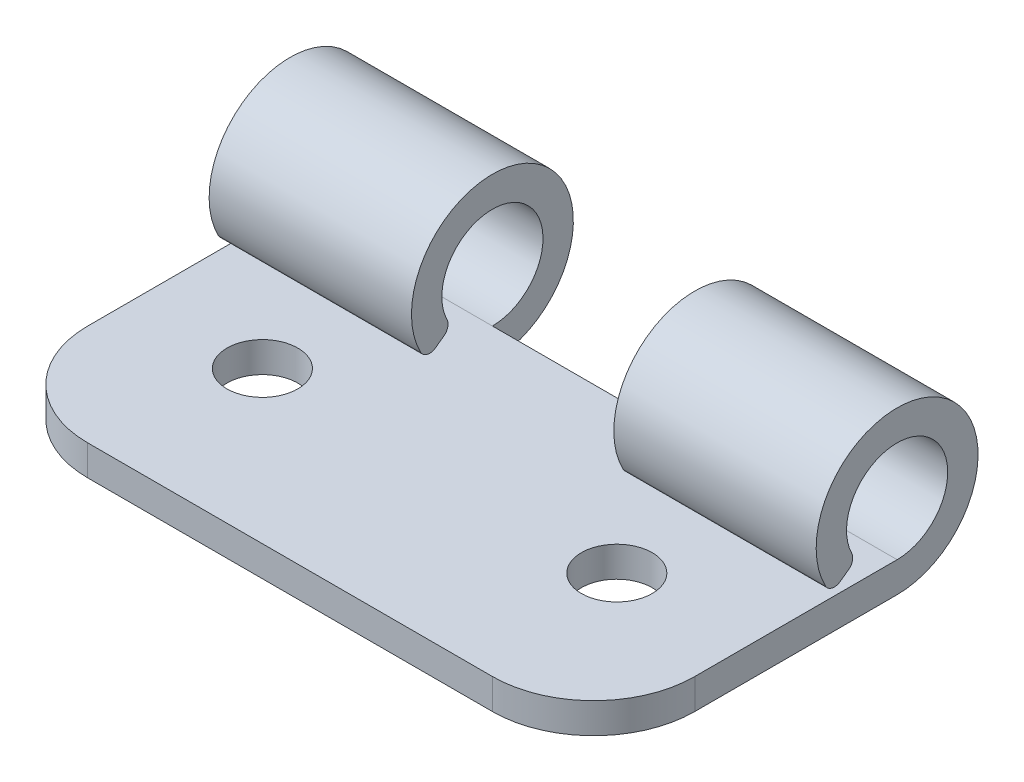
ISO-10303-21;
HEADER;
FILE_DESCRIPTION(('STEP AP214'),'2;1');
FILE_NAME('part.step','',(''),(''),'','','');
FILE_SCHEMA(('AUTOMOTIVE_DESIGN { 1 0 10303 214 1 1 1 1 }'));
ENDSEC;
DATA;
#1=APPLICATION_CONTEXT('core data for automotive mechanical design processes');
#2=APPLICATION_PROTOCOL_DEFINITION('international standard','automotive_design',2000,#1);
#3=PRODUCT_CONTEXT('',#1,'mechanical');
#4=PRODUCT('Part','Part','',(#3));
#5=PRODUCT_RELATED_PRODUCT_CATEGORY('part','',(#4));
#6=PRODUCT_DEFINITION_FORMATION('','',#4);
#7=PRODUCT_DEFINITION_CONTEXT('part definition',#1,'design');
#8=PRODUCT_DEFINITION('design','',#6,#7);
#9=PRODUCT_DEFINITION_SHAPE('','',#8);
#10=(LENGTH_UNIT() NAMED_UNIT(*) SI_UNIT(.MILLI.,.METRE.));
#11=(NAMED_UNIT(*) PLANE_ANGLE_UNIT() SI_UNIT($,.RADIAN.));
#12=(NAMED_UNIT(*) SI_UNIT($,.STERADIAN.) SOLID_ANGLE_UNIT());
#13=UNCERTAINTY_MEASURE_WITH_UNIT(LENGTH_MEASURE(1.E-05),#10,'distance_accuracy_value','');
#14=(GEOMETRIC_REPRESENTATION_CONTEXT(3) GLOBAL_UNCERTAINTY_ASSIGNED_CONTEXT((#13)) GLOBAL_UNIT_ASSIGNED_CONTEXT((#10,
#11,#12)) REPRESENTATION_CONTEXT('',''));
#15=CARTESIAN_POINT('',(0.,0.,0.));
#16=DIRECTION('',(0.,0.,1.));
#17=DIRECTION('',(1.,0.,0.));
#18=AXIS2_PLACEMENT_3D('',#15,#16,#17);
#19=CARTESIAN_POINT('',(-15.,1.5,-7.5));
#20=DIRECTION('',(0.,0.,-1.));
#21=DIRECTION('',(-1.,0.,0.));
#22=AXIS2_PLACEMENT_3D('',#19,#20,#21);
#23=PLANE('',#22);
#24=DIRECTION('',(1.,0.,0.));
#25=VECTOR('',#24,1.);
#26=CARTESIAN_POINT('',(-15.,0.,-7.5));
#27=LINE('',#26,#25);
#28=CARTESIAN_POINT('',(-5.,0.,-7.5));
#29=VERTEX_POINT('',#28);
#30=CARTESIAN_POINT('',(5.,0.,-7.5));
#31=VERTEX_POINT('',#30);
#32=EDGE_CURVE('E92',#29,#31,#27,.T.);
#33=ORIENTED_EDGE('',*,*,#32,.F.);
#34=DIRECTION('',(0.,-1.,0.));
#35=VECTOR('',#34,1.);
#36=CARTESIAN_POINT('',(-5.,1.5,-7.5));
#37=LINE('',#36,#35);
#38=CARTESIAN_POINT('',(-5.,1.5,-7.5));
#39=VERTEX_POINT('',#38);
#40=EDGE_CURVE('E183',#39,#29,#37,.T.);
#41=ORIENTED_EDGE('',*,*,#40,.F.);
#42=DIRECTION('',(1.,0.,0.));
#43=VECTOR('',#42,1.);
#44=CARTESIAN_POINT('',(-15.,1.5,-7.5));
#45=LINE('',#44,#43);
#46=CARTESIAN_POINT('',(5.,1.5,-7.5));
#47=VERTEX_POINT('',#46);
#48=EDGE_CURVE('E84',#39,#47,#45,.T.);
#49=ORIENTED_EDGE('',*,*,#48,.T.);
#50=DIRECTION('',(0.,-1.,0.));
#51=VECTOR('',#50,1.);
#52=CARTESIAN_POINT('',(5.,1.5,-7.5));
#53=LINE('',#52,#51);
#54=EDGE_CURVE('E203',#47,#31,#53,.T.);
#55=ORIENTED_EDGE('',*,*,#54,.T.);
#56=EDGE_LOOP('',(#33,#41,#49,#55));
#57=FACE_BOUND('',#56,.T.);
#58=ADVANCED_FACE('F69',(#57),#23,.T.);
#59=CARTESIAN_POINT('',(0.,1.5,0.));
#60=DIRECTION('',(0.,-1.,0.));
#61=DIRECTION('',(0.,0.,-1.));
#62=AXIS2_PLACEMENT_3D('',#59,#60,#61);
#63=PLANE('',#62);
#64=DIRECTION('',(1.,0.,0.));
#65=VECTOR('',#64,1.);
#66=CARTESIAN_POINT('',(-15.,1.5,7.5));
#67=LINE('',#66,#65);
#68=CARTESIAN_POINT('',(-10.,1.5,7.5));
#69=VERTEX_POINT('',#68);
#70=CARTESIAN_POINT('',(10.,1.5,7.5));
#71=VERTEX_POINT('',#70);
#72=EDGE_CURVE('E224',#69,#71,#67,.T.);
#73=ORIENTED_EDGE('',*,*,#72,.T.);
#74=CARTESIAN_POINT('',(10.,1.5,2.5));
#75=DIRECTION('',(0.,-1.,0.));
#76=DIRECTION('',(0.,0.,-1.));
#77=AXIS2_PLACEMENT_3D('',#74,#75,#76);
#78=CIRCLE('',#77,5.);
#79=CARTESIAN_POINT('',(15.,1.5,2.5));
#80=VERTEX_POINT('',#79);
#81=EDGE_CURVE('E77',#71,#80,#78,.F.);
#82=ORIENTED_EDGE('',*,*,#81,.T.);
#83=DIRECTION('',(0.,0.,-1.));
#84=VECTOR('',#83,1.);
#85=CARTESIAN_POINT('',(15.,1.5,7.5));
#86=LINE('',#85,#84);
#87=CARTESIAN_POINT('',(15.,1.5,-7.5));
#88=VERTEX_POINT('',#87);
#89=EDGE_CURVE('E240',#80,#88,#86,.T.);
#90=ORIENTED_EDGE('',*,*,#89,.T.);
#91=DIRECTION('',(1.,0.,0.));
#92=VECTOR('',#91,1.);
#93=CARTESIAN_POINT('',(5.,1.5,-7.5));
#94=LINE('',#93,#92);
#95=EDGE_CURVE('E287',#47,#88,#94,.T.);
#96=ORIENTED_EDGE('',*,*,#95,.F.);
#97=ORIENTED_EDGE('',*,*,#48,.F.);
#98=CARTESIAN_POINT('',(-15.,1.5,-7.5));
#99=VERTEX_POINT('',#98);
#100=EDGE_CURVE('E252',#99,#39,#45,.T.);
#101=ORIENTED_EDGE('',*,*,#100,.F.);
#102=DIRECTION('',(0.,0.,-1.));
#103=VECTOR('',#102,1.);
#104=CARTESIAN_POINT('',(-15.,1.5,7.5));
#105=LINE('',#104,#103);
#106=CARTESIAN_POINT('',(-15.,1.5,2.5));
#107=VERTEX_POINT('',#106);
#108=EDGE_CURVE('E219',#107,#99,#105,.T.);
#109=ORIENTED_EDGE('',*,*,#108,.F.);
#110=CARTESIAN_POINT('',(-10.,1.5,2.5));
#111=DIRECTION('',(0.,-1.,0.));
#112=DIRECTION('',(0.,0.,-1.));
#113=AXIS2_PLACEMENT_3D('',#110,#111,#112);
#114=CIRCLE('',#113,5.);
#115=EDGE_CURVE('E233',#107,#69,#114,.F.);
#116=ORIENTED_EDGE('',*,*,#115,.T.);
#117=EDGE_LOOP('',(#73,#82,#90,#96,#97,#101,#109,#116));
#118=FACE_BOUND('',#117,.T.);
#119=CARTESIAN_POINT('',(-8.86733098836335,1.5,0.));
#120=DIRECTION('',(0.,1.,0.));
#121=DIRECTION('',(0.,0.,1.));
#122=AXIS2_PLACEMENT_3D('',#119,#120,#121);
#123=CIRCLE('',#122,1.75);
#124=CARTESIAN_POINT('',(-8.86733098836335,1.5,1.75));
#125=VERTEX_POINT('',#124);
#126=EDGE_CURVE('E267',#125,#125,#123,.T.);
#127=ORIENTED_EDGE('',*,*,#126,.F.);
#128=EDGE_LOOP('',(#127));
#129=FACE_BOUND('',#128,.T.);
#130=CARTESIAN_POINT('',(8.64739718707362,1.5,0.));
#131=DIRECTION('',(0.,1.,0.));
#132=DIRECTION('',(0.,0.,1.));
#133=AXIS2_PLACEMENT_3D('',#130,#131,#132);
#134=CIRCLE('',#133,1.75);
#135=CARTESIAN_POINT('',(8.64739718707362,1.5,1.75));
#136=VERTEX_POINT('',#135);
#137=EDGE_CURVE('E274',#136,#136,#134,.T.);
#138=ORIENTED_EDGE('',*,*,#137,.F.);
#139=EDGE_LOOP('',(#138));
#140=FACE_BOUND('',#139,.T.);
#141=ADVANCED_FACE('F238',(#118,#129,#140),#63,.F.);
#142=CARTESIAN_POINT('',(0.,0.,0.));
#143=DIRECTION('',(0.,-1.,0.));
#144=DIRECTION('',(0.,0.,-1.));
#145=AXIS2_PLACEMENT_3D('',#142,#143,#144);
#146=PLANE('',#145);
#147=CARTESIAN_POINT('',(-8.86733098836335,0.,0.));
#148=DIRECTION('',(0.,1.,0.));
#149=DIRECTION('',(0.,0.,1.));
#150=AXIS2_PLACEMENT_3D('',#147,#148,#149);
#151=CIRCLE('',#150,1.75);
#152=CARTESIAN_POINT('',(-8.86733098836335,0.,1.75));
#153=VERTEX_POINT('',#152);
#154=EDGE_CURVE('E269',#153,#153,#151,.T.);
#155=ORIENTED_EDGE('',*,*,#154,.T.);
#156=EDGE_LOOP('',(#155));
#157=FACE_BOUND('',#156,.T.);
#158=DIRECTION('',(0.,0.,-1.));
#159=VECTOR('',#158,1.);
#160=CARTESIAN_POINT('',(15.,0.,7.5));
#161=LINE('',#160,#159);
#162=CARTESIAN_POINT('',(15.,0.,2.5));
#163=VERTEX_POINT('',#162);
#164=CARTESIAN_POINT('',(15.,0.,-7.5));
#165=VERTEX_POINT('',#164);
#166=EDGE_CURVE('E211',#163,#165,#161,.T.);
#167=ORIENTED_EDGE('',*,*,#166,.F.);
#168=CARTESIAN_POINT('',(10.,0.,2.5));
#169=DIRECTION('',(0.,-1.,0.));
#170=DIRECTION('',(0.,0.,-1.));
#171=AXIS2_PLACEMENT_3D('',#168,#169,#170);
#172=CIRCLE('',#171,5.);
#173=CARTESIAN_POINT('',(10.,0.,7.5));
#174=VERTEX_POINT('',#173);
#175=EDGE_CURVE('E226',#163,#174,#172,.T.);
#176=ORIENTED_EDGE('',*,*,#175,.T.);
#177=DIRECTION('',(1.,0.,0.));
#178=VECTOR('',#177,1.);
#179=CARTESIAN_POINT('',(-15.,0.,7.5));
#180=LINE('',#179,#178);
#181=CARTESIAN_POINT('',(-10.,0.,7.5));
#182=VERTEX_POINT('',#181);
#183=EDGE_CURVE('E212',#182,#174,#180,.T.);
#184=ORIENTED_EDGE('',*,*,#183,.F.);
#185=CARTESIAN_POINT('',(-10.,0.,2.5));
#186=DIRECTION('',(0.,-1.,0.));
#187=DIRECTION('',(0.,0.,-1.));
#188=AXIS2_PLACEMENT_3D('',#185,#186,#187);
#189=CIRCLE('',#188,5.);
#190=CARTESIAN_POINT('',(-15.,0.,2.5));
#191=VERTEX_POINT('',#190);
#192=EDGE_CURVE('E223',#182,#191,#189,.T.);
#193=ORIENTED_EDGE('',*,*,#192,.T.);
#194=DIRECTION('',(0.,0.,-1.));
#195=VECTOR('',#194,1.);
#196=CARTESIAN_POINT('',(-15.,0.,7.5));
#197=LINE('',#196,#195);
#198=CARTESIAN_POINT('',(-15.,0.,-7.5));
#199=VERTEX_POINT('',#198);
#200=EDGE_CURVE('E205',#191,#199,#197,.T.);
#201=ORIENTED_EDGE('',*,*,#200,.T.);
#202=EDGE_CURVE('E196',#199,#29,#27,.T.);
#203=ORIENTED_EDGE('',*,*,#202,.T.);
#204=ORIENTED_EDGE('',*,*,#32,.T.);
#205=DIRECTION('',(1.,0.,0.));
#206=VECTOR('',#205,1.);
#207=CARTESIAN_POINT('',(5.,0.,-7.5));
#208=LINE('',#207,#206);
#209=EDGE_CURVE('E290',#31,#165,#208,.T.);
#210=ORIENTED_EDGE('',*,*,#209,.T.);
#211=EDGE_LOOP('',(#167,#176,#184,#193,#201,#203,#204,#210));
#212=FACE_BOUND('',#211,.T.);
#213=CARTESIAN_POINT('',(8.64739718707362,0.,0.));
#214=DIRECTION('',(0.,1.,0.));
#215=DIRECTION('',(0.,0.,1.));
#216=AXIS2_PLACEMENT_3D('',#213,#214,#215);
#217=CIRCLE('',#216,1.75);
#218=CARTESIAN_POINT('',(8.64739718707362,0.,1.75));
#219=VERTEX_POINT('',#218);
#220=EDGE_CURVE('E277',#219,#219,#217,.T.);
#221=ORIENTED_EDGE('',*,*,#220,.T.);
#222=EDGE_LOOP('',(#221));
#223=FACE_BOUND('',#222,.T.);
#224=ADVANCED_FACE('F208',(#157,#212,#223),#146,.T.);
#225=CARTESIAN_POINT('',(-15.,1.5,7.5));
#226=DIRECTION('',(-1.,0.,0.));
#227=DIRECTION('',(0.,0.,1.));
#228=AXIS2_PLACEMENT_3D('',#225,#226,#227);
#229=PLANE('',#228);
#230=ORIENTED_EDGE('',*,*,#200,.F.);
#231=DIRECTION('',(0.,-1.,0.));
#232=VECTOR('',#231,1.);
#233=CARTESIAN_POINT('',(-15.,1.5,2.5));
#234=LINE('',#233,#232);
#235=EDGE_CURVE('E12',#191,#107,#234,.F.);
#236=ORIENTED_EDGE('',*,*,#235,.T.);
#237=ORIENTED_EDGE('',*,*,#108,.T.);
#238=CARTESIAN_POINT('',(-15.,4.,-7.5));
#239=DIRECTION('',(-1.,0.,0.));
#240=DIRECTION('',(0.,0.,-1.));
#241=AXIS2_PLACEMENT_3D('',#238,#239,#240);
#242=CIRCLE('',#241,2.5);
#243=CARTESIAN_POINT('',(-15.,2.8971410584487,-5.25640864793957));
#244=VERTEX_POINT('',#243);
#245=EDGE_CURVE('E286',#244,#99,#242,.T.);
#246=ORIENTED_EDGE('',*,*,#245,.F.);
#247=CARTESIAN_POINT('',(-15.,2.67656927013843,-4.80769037752749));
#248=DIRECTION('',(1.,0.,0.));
#249=DIRECTION('',(0.,0.,1.));
#250=AXIS2_PLACEMENT_3D('',#247,#248,#249);
#251=CIRCLE('',#250,0.5);
#252=CARTESIAN_POINT('',(-15.,2.27088905354142,-5.09996347218691));
#253=VERTEX_POINT('',#252);
#254=EDGE_CURVE('E576',#253,#244,#251,.T.);
#255=ORIENTED_EDGE('',*,*,#254,.F.);
#256=DIRECTION('',(0.,0.58454618931885,-0.811360433194035));
#257=VECTOR('',#256,1.);
#258=CARTESIAN_POINT('',(-15.,1.97507260145795,-4.68936501291368));
#259=LINE('',#258,#257);
#260=CARTESIAN_POINT('',(-15.,1.97507260145795,-4.68936501291368));
#261=VERTEX_POINT('',#260);
#262=EDGE_CURVE('E582',#261,#253,#259,.T.);
#263=ORIENTED_EDGE('',*,*,#262,.F.);
#264=CARTESIAN_POINT('',(-15.,2.38075281805497,-4.39709191825425));
#265=DIRECTION('',(1.,0.,0.));
#266=DIRECTION('',(0.,0.,1.));
#267=AXIS2_PLACEMENT_3D('',#264,#265,#266);
#268=CIRCLE('',#267,0.5);
#269=CARTESIAN_POINT('',(-15.,2.14943179206282,-3.95381933514772));
#270=VERTEX_POINT('',#269);
#271=EDGE_CURVE('E200',#270,#261,#268,.T.);
#272=ORIENTED_EDGE('',*,*,#271,.F.);
#273=CARTESIAN_POINT('',(-15.,4.,-7.5));
#274=DIRECTION('',(1.,0.,0.));
#275=DIRECTION('',(0.,0.,-1.));
#276=AXIS2_PLACEMENT_3D('',#273,#274,#275);
#277=CIRCLE('',#276,4.);
#278=EDGE_CURVE('E266',#199,#270,#277,.T.);
#279=ORIENTED_EDGE('',*,*,#278,.F.);
#280=EDGE_LOOP('',(#230,#236,#237,#246,#255,#263,#272,#279));
#281=FACE_BOUND('',#280,.T.);
#282=ADVANCED_FACE('F263',(#281),#229,.T.);
#283=CARTESIAN_POINT('',(-15.,1.5,7.5));
#284=DIRECTION('',(0.,0.,-1.));
#285=DIRECTION('',(-1.,0.,0.));
#286=AXIS2_PLACEMENT_3D('',#283,#284,#285);
#287=PLANE('',#286);
#288=ORIENTED_EDGE('',*,*,#183,.T.);
#289=DIRECTION('',(0.,-1.,0.));
#290=VECTOR('',#289,1.);
#291=CARTESIAN_POINT('',(10.,1.5,7.5));
#292=LINE('',#291,#290);
#293=EDGE_CURVE('E231',#174,#71,#292,.F.);
#294=ORIENTED_EDGE('',*,*,#293,.T.);
#295=ORIENTED_EDGE('',*,*,#72,.F.);
#296=DIRECTION('',(0.,-1.,0.));
#297=VECTOR('',#296,1.);
#298=CARTESIAN_POINT('',(-10.,0.,7.5));
#299=LINE('',#298,#297);
#300=EDGE_CURVE('E228',#69,#182,#299,.T.);
#301=ORIENTED_EDGE('',*,*,#300,.T.);
#302=EDGE_LOOP('',(#288,#294,#295,#301));
#303=FACE_BOUND('',#302,.T.);
#304=ADVANCED_FACE('F257',(#303),#287,.F.);
#305=CARTESIAN_POINT('',(15.,1.5,7.5));
#306=DIRECTION('',(-1.,0.,0.));
#307=DIRECTION('',(0.,0.,1.));
#308=AXIS2_PLACEMENT_3D('',#305,#306,#307);
#309=PLANE('',#308);
#310=ORIENTED_EDGE('',*,*,#89,.F.);
#311=DIRECTION('',(0.,-1.,0.));
#312=VECTOR('',#311,1.);
#313=CARTESIAN_POINT('',(15.,1.5,2.5));
#314=LINE('',#313,#312);
#315=EDGE_CURVE('E220',#80,#163,#314,.T.);
#316=ORIENTED_EDGE('',*,*,#315,.T.);
#317=ORIENTED_EDGE('',*,*,#166,.T.);
#318=CARTESIAN_POINT('',(15.,4.,-7.5));
#319=DIRECTION('',(1.,0.,0.));
#320=DIRECTION('',(0.,0.,-1.));
#321=AXIS2_PLACEMENT_3D('',#318,#319,#320);
#322=CIRCLE('',#321,4.);
#323=CARTESIAN_POINT('',(15.,2.14943179206282,-3.95381933514772));
#324=VERTEX_POINT('',#323);
#325=EDGE_CURVE('E312',#165,#324,#322,.T.);
#326=ORIENTED_EDGE('',*,*,#325,.T.);
#327=CARTESIAN_POINT('',(15.,2.38075281805497,-4.39709191825425));
#328=DIRECTION('',(1.,0.,0.));
#329=DIRECTION('',(0.,0.,1.));
#330=AXIS2_PLACEMENT_3D('',#327,#328,#329);
#331=CIRCLE('',#330,0.5);
#332=CARTESIAN_POINT('',(15.,1.97507260145795,-4.68936501291368));
#333=VERTEX_POINT('',#332);
#334=EDGE_CURVE('E315',#324,#333,#331,.T.);
#335=ORIENTED_EDGE('',*,*,#334,.T.);
#336=DIRECTION('',(0.,0.58454618931885,-0.811360433194035));
#337=VECTOR('',#336,1.);
#338=CARTESIAN_POINT('',(15.,1.97507260145795,-4.68936501291368));
#339=LINE('',#338,#337);
#340=CARTESIAN_POINT('',(15.,2.27088905354142,-5.09996347218691));
#341=VERTEX_POINT('',#340);
#342=EDGE_CURVE('E318',#333,#341,#339,.T.);
#343=ORIENTED_EDGE('',*,*,#342,.T.);
#344=CARTESIAN_POINT('',(15.,2.67656927013843,-4.80769037752749));
#345=DIRECTION('',(1.,0.,0.));
#346=DIRECTION('',(0.,0.,1.));
#347=AXIS2_PLACEMENT_3D('',#344,#345,#346);
#348=CIRCLE('',#347,0.5);
#349=CARTESIAN_POINT('',(15.,2.8971410584487,-5.25640864793957));
#350=VERTEX_POINT('',#349);
#351=EDGE_CURVE('E321',#341,#350,#348,.T.);
#352=ORIENTED_EDGE('',*,*,#351,.T.);
#353=CARTESIAN_POINT('',(15.,4.,-7.5));
#354=DIRECTION('',(-1.,0.,0.));
#355=DIRECTION('',(0.,0.,-1.));
#356=AXIS2_PLACEMENT_3D('',#353,#354,#355);
#357=CIRCLE('',#356,2.5);
#358=EDGE_CURVE('E251',#350,#88,#357,.T.);
#359=ORIENTED_EDGE('',*,*,#358,.T.);
#360=EDGE_LOOP('',(#310,#316,#317,#326,#335,#343,#352,#359));
#361=FACE_BOUND('',#360,.T.);
#362=ADVANCED_FACE('F248',(#361),#309,.F.);
#363=CARTESIAN_POINT('',(-8.86733098836335,1.5,0.));
#364=DIRECTION('',(0.,-1.,0.));
#365=DIRECTION('',(0.,0.,-1.));
#366=AXIS2_PLACEMENT_3D('',#363,#364,#365);
#367=CYLINDRICAL_SURFACE('',#366,1.75);
#368=ORIENTED_EDGE('',*,*,#126,.T.);
#369=EDGE_LOOP('',(#368));
#370=FACE_BOUND('',#369,.T.);
#371=ORIENTED_EDGE('',*,*,#154,.F.);
#372=EDGE_LOOP('',(#371));
#373=FACE_BOUND('',#372,.T.);
#374=ADVANCED_FACE('F336',(#370,#373),#367,.F.);
#375=CARTESIAN_POINT('',(8.64739718707362,1.5,0.));
#376=DIRECTION('',(0.,-1.,0.));
#377=DIRECTION('',(0.,0.,-1.));
#378=AXIS2_PLACEMENT_3D('',#375,#376,#377);
#379=CYLINDRICAL_SURFACE('',#378,1.75);
#380=ORIENTED_EDGE('',*,*,#137,.T.);
#381=EDGE_LOOP('',(#380));
#382=FACE_BOUND('',#381,.T.);
#383=ORIENTED_EDGE('',*,*,#220,.F.);
#384=EDGE_LOOP('',(#383));
#385=FACE_BOUND('',#384,.T.);
#386=ADVANCED_FACE('F334',(#382,#385),#379,.F.);
#387=CARTESIAN_POINT('',(10.,1.5,2.5));
#388=DIRECTION('',(0.,-1.,0.));
#389=DIRECTION('',(0.,0.,-1.));
#390=AXIS2_PLACEMENT_3D('',#387,#388,#389);
#391=CYLINDRICAL_SURFACE('',#390,5.);
#392=ORIENTED_EDGE('',*,*,#81,.F.);
#393=ORIENTED_EDGE('',*,*,#293,.F.);
#394=ORIENTED_EDGE('',*,*,#175,.F.);
#395=ORIENTED_EDGE('',*,*,#315,.F.);
#396=EDGE_LOOP('',(#392,#393,#394,#395));
#397=FACE_BOUND('',#396,.T.);
#398=ADVANCED_FACE('F254',(#397),#391,.T.);
#399=CARTESIAN_POINT('',(-10.,1.5,2.5));
#400=DIRECTION('',(0.,1.,0.));
#401=DIRECTION('',(0.,0.,1.));
#402=AXIS2_PLACEMENT_3D('',#399,#400,#401);
#403=CYLINDRICAL_SURFACE('',#402,5.);
#404=ORIENTED_EDGE('',*,*,#115,.F.);
#405=ORIENTED_EDGE('',*,*,#235,.F.);
#406=ORIENTED_EDGE('',*,*,#192,.F.);
#407=ORIENTED_EDGE('',*,*,#300,.F.);
#408=EDGE_LOOP('',(#404,#405,#406,#407));
#409=FACE_BOUND('',#408,.T.);
#410=ADVANCED_FACE('F71',(#409),#403,.T.);
#411=CARTESIAN_POINT('',(5.,4.,-7.5));
#412=DIRECTION('',(1.,0.,0.));
#413=DIRECTION('',(0.,0.,-1.));
#414=AXIS2_PLACEMENT_3D('',#411,#412,#413);
#415=CYLINDRICAL_SURFACE('',#414,4.);
#416=ORIENTED_EDGE('',*,*,#325,.F.);
#417=ORIENTED_EDGE('',*,*,#209,.F.);
#418=CARTESIAN_POINT('',(5.,4.,-7.5));
#419=DIRECTION('',(1.,0.,0.));
#420=DIRECTION('',(0.,0.,-1.));
#421=AXIS2_PLACEMENT_3D('',#418,#419,#420);
#422=CIRCLE('',#421,4.);
#423=CARTESIAN_POINT('',(5.,2.14943179206282,-3.95381933514772));
#424=VERTEX_POINT('',#423);
#425=EDGE_CURVE('E305',#31,#424,#422,.T.);
#426=ORIENTED_EDGE('',*,*,#425,.T.);
#427=DIRECTION('',(1.,0.,0.));
#428=VECTOR('',#427,1.);
#429=CARTESIAN_POINT('',(5.,2.14943179206282,-3.95381933514772));
#430=LINE('',#429,#428);
#431=EDGE_CURVE('E306',#424,#324,#430,.T.);
#432=ORIENTED_EDGE('',*,*,#431,.T.);
#433=EDGE_LOOP('',(#416,#417,#426,#432));
#434=FACE_BOUND('',#433,.T.);
#435=ADVANCED_FACE('F428',(#434),#415,.T.);
#436=CARTESIAN_POINT('',(5.,4.,-7.5));
#437=DIRECTION('',(1.,0.,0.));
#438=DIRECTION('',(0.,0.,-1.));
#439=AXIS2_PLACEMENT_3D('',#436,#437,#438);
#440=CYLINDRICAL_SURFACE('',#439,2.5);
#441=ORIENTED_EDGE('',*,*,#358,.F.);
#442=DIRECTION('',(1.,0.,0.));
#443=VECTOR('',#442,1.);
#444=CARTESIAN_POINT('',(5.,2.8971410584487,-5.25640864793957));
#445=LINE('',#444,#443);
#446=CARTESIAN_POINT('',(5.,2.8971410584487,-5.25640864793957));
#447=VERTEX_POINT('',#446);
#448=EDGE_CURVE('E291',#447,#350,#445,.T.);
#449=ORIENTED_EDGE('',*,*,#448,.F.);
#450=CARTESIAN_POINT('',(5.,4.,-7.5));
#451=DIRECTION('',(-1.,0.,0.));
#452=DIRECTION('',(0.,0.,-1.));
#453=AXIS2_PLACEMENT_3D('',#450,#451,#452);
#454=CIRCLE('',#453,2.5);
#455=EDGE_CURVE('E294',#447,#47,#454,.T.);
#456=ORIENTED_EDGE('',*,*,#455,.T.);
#457=ORIENTED_EDGE('',*,*,#95,.T.);
#458=EDGE_LOOP('',(#441,#449,#456,#457));
#459=FACE_BOUND('',#458,.T.);
#460=ADVANCED_FACE('F295',(#459),#440,.F.);
#461=CARTESIAN_POINT('',(5.,2.67656927013843,-4.80769037752749));
#462=DIRECTION('',(1.,0.,0.));
#463=DIRECTION('',(0.,0.,-1.));
#464=AXIS2_PLACEMENT_3D('',#461,#462,#463);
#465=CYLINDRICAL_SURFACE('',#464,0.5);
#466=ORIENTED_EDGE('',*,*,#351,.F.);
#467=DIRECTION('',(1.,0.,0.));
#468=VECTOR('',#467,1.);
#469=CARTESIAN_POINT('',(5.,2.27088905354142,-5.09996347218691));
#470=LINE('',#469,#468);
#471=CARTESIAN_POINT('',(5.,2.27088905354142,-5.09996347218691));
#472=VERTEX_POINT('',#471);
#473=EDGE_CURVE('E326',#472,#341,#470,.T.);
#474=ORIENTED_EDGE('',*,*,#473,.F.);
#475=CARTESIAN_POINT('',(5.,2.67656927013843,-4.80769037752749));
#476=DIRECTION('',(1.,0.,0.));
#477=DIRECTION('',(0.,0.,1.));
#478=AXIS2_PLACEMENT_3D('',#475,#476,#477);
#479=CIRCLE('',#478,0.5);
#480=EDGE_CURVE('E299',#472,#447,#479,.T.);
#481=ORIENTED_EDGE('',*,*,#480,.T.);
#482=ORIENTED_EDGE('',*,*,#448,.T.);
#483=EDGE_LOOP('',(#466,#474,#481,#482));
#484=FACE_BOUND('',#483,.T.);
#485=ADVANCED_FACE('F407',(#484),#465,.T.);
#486=CARTESIAN_POINT('',(5.,1.97507260145795,-4.68936501291368));
#487=DIRECTION('',(0.,-0.811360433194035,-0.58454618931885));
#488=DIRECTION('',(0.,0.58454618931885,-0.811360433194035));
#489=AXIS2_PLACEMENT_3D('',#486,#487,#488);
#490=PLANE('',#489);
#491=ORIENTED_EDGE('',*,*,#342,.F.);
#492=DIRECTION('',(1.,0.,0.));
#493=VECTOR('',#492,1.);
#494=CARTESIAN_POINT('',(5.,1.97507260145795,-4.68936501291368));
#495=LINE('',#494,#493);
#496=CARTESIAN_POINT('',(5.,1.97507260145795,-4.68936501291368));
#497=VERTEX_POINT('',#496);
#498=EDGE_CURVE('E308',#497,#333,#495,.T.);
#499=ORIENTED_EDGE('',*,*,#498,.F.);
#500=DIRECTION('',(0.,0.58454618931885,-0.811360433194035));
#501=VECTOR('',#500,1.);
#502=CARTESIAN_POINT('',(5.,1.97507260145795,-4.68936501291368));
#503=LINE('',#502,#501);
#504=EDGE_CURVE('E601',#497,#472,#503,.T.);
#505=ORIENTED_EDGE('',*,*,#504,.T.);
#506=ORIENTED_EDGE('',*,*,#473,.T.);
#507=EDGE_LOOP('',(#491,#499,#505,#506));
#508=FACE_BOUND('',#507,.T.);
#509=ADVANCED_FACE('F396',(#508),#490,.T.);
#510=CARTESIAN_POINT('',(5.,2.38075281805497,-4.39709191825425));
#511=DIRECTION('',(1.,0.,0.));
#512=DIRECTION('',(0.,0.,-1.));
#513=AXIS2_PLACEMENT_3D('',#510,#511,#512);
#514=CYLINDRICAL_SURFACE('',#513,0.5);
#515=ORIENTED_EDGE('',*,*,#334,.F.);
#516=ORIENTED_EDGE('',*,*,#431,.F.);
#517=CARTESIAN_POINT('',(5.,2.38075281805497,-4.39709191825425));
#518=DIRECTION('',(1.,0.,0.));
#519=DIRECTION('',(0.,0.,1.));
#520=AXIS2_PLACEMENT_3D('',#517,#518,#519);
#521=CIRCLE('',#520,0.5);
#522=EDGE_CURVE('E598',#424,#497,#521,.T.);
#523=ORIENTED_EDGE('',*,*,#522,.T.);
#524=ORIENTED_EDGE('',*,*,#498,.T.);
#525=EDGE_LOOP('',(#515,#516,#523,#524));
#526=FACE_BOUND('',#525,.T.);
#527=ADVANCED_FACE('F385',(#526),#514,.T.);
#528=CARTESIAN_POINT('',(5.,4.,-7.5));
#529=DIRECTION('',(1.,0.,0.));
#530=DIRECTION('',(0.,0.,-1.));
#531=AXIS2_PLACEMENT_3D('',#528,#529,#530);
#532=PLANE('',#531);
#533=ORIENTED_EDGE('',*,*,#425,.F.);
#534=ORIENTED_EDGE('',*,*,#54,.F.);
#535=ORIENTED_EDGE('',*,*,#455,.F.);
#536=ORIENTED_EDGE('',*,*,#480,.F.);
#537=ORIENTED_EDGE('',*,*,#504,.F.);
#538=ORIENTED_EDGE('',*,*,#522,.F.);
#539=EDGE_LOOP('',(#533,#534,#535,#536,#537,#538));
#540=FACE_BOUND('',#539,.T.);
#541=ADVANCED_FACE('F302',(#540),#532,.F.);
#542=CARTESIAN_POINT('',(-5.,4.,-7.5));
#543=DIRECTION('',(-1.,0.,0.));
#544=DIRECTION('',(0.,0.,1.));
#545=AXIS2_PLACEMENT_3D('',#542,#543,#544);
#546=CYLINDRICAL_SURFACE('',#545,4.);
#547=ORIENTED_EDGE('',*,*,#278,.T.);
#548=DIRECTION('',(-1.,0.,0.));
#549=VECTOR('',#548,1.);
#550=CARTESIAN_POINT('',(-5.,2.14943179206282,-3.95381933514772));
#551=LINE('',#550,#549);
#552=CARTESIAN_POINT('',(-5.,2.14943179206282,-3.95381933514772));
#553=VERTEX_POINT('',#552);
#554=EDGE_CURVE('E199',#553,#270,#551,.T.);
#555=ORIENTED_EDGE('',*,*,#554,.F.);
#556=CARTESIAN_POINT('',(-5.,4.,-7.5));
#557=DIRECTION('',(1.,0.,0.));
#558=DIRECTION('',(0.,0.,-1.));
#559=AXIS2_PLACEMENT_3D('',#556,#557,#558);
#560=CIRCLE('',#559,4.);
#561=EDGE_CURVE('E186',#29,#553,#560,.T.);
#562=ORIENTED_EDGE('',*,*,#561,.F.);
#563=ORIENTED_EDGE('',*,*,#202,.F.);
#564=EDGE_LOOP('',(#547,#555,#562,#563));
#565=FACE_BOUND('',#564,.T.);
#566=ADVANCED_FACE('F195',(#565),#546,.T.);
#567=CARTESIAN_POINT('',(-5.,2.38075281805497,-4.39709191825425));
#568=DIRECTION('',(-1.,0.,0.));
#569=DIRECTION('',(0.,0.,1.));
#570=AXIS2_PLACEMENT_3D('',#567,#568,#569);
#571=CYLINDRICAL_SURFACE('',#570,0.5);
#572=ORIENTED_EDGE('',*,*,#271,.T.);
#573=DIRECTION('',(-1.,0.,0.));
#574=VECTOR('',#573,1.);
#575=CARTESIAN_POINT('',(-5.,1.97507260145795,-4.68936501291368));
#576=LINE('',#575,#574);
#577=CARTESIAN_POINT('',(-5.,1.97507260145795,-4.68936501291368));
#578=VERTEX_POINT('',#577);
#579=EDGE_CURVE('E593',#578,#261,#576,.T.);
#580=ORIENTED_EDGE('',*,*,#579,.F.);
#581=CARTESIAN_POINT('',(-5.,2.38075281805497,-4.39709191825425));
#582=DIRECTION('',(1.,0.,0.));
#583=DIRECTION('',(0.,0.,1.));
#584=AXIS2_PLACEMENT_3D('',#581,#582,#583);
#585=CIRCLE('',#584,0.5);
#586=EDGE_CURVE('E584',#553,#578,#585,.T.);
#587=ORIENTED_EDGE('',*,*,#586,.F.);
#588=ORIENTED_EDGE('',*,*,#554,.T.);
#589=EDGE_LOOP('',(#572,#580,#587,#588));
#590=FACE_BOUND('',#589,.T.);
#591=ADVANCED_FACE('F514',(#590),#571,.T.);
#592=CARTESIAN_POINT('',(-5.,1.97507260145795,-4.68936501291368));
#593=DIRECTION('',(0.,0.811360433194035,0.58454618931885));
#594=DIRECTION('',(0.,-0.58454618931885,0.811360433194035));
#595=AXIS2_PLACEMENT_3D('',#592,#593,#594);
#596=PLANE('',#595);
#597=ORIENTED_EDGE('',*,*,#262,.T.);
#598=DIRECTION('',(-1.,0.,0.));
#599=VECTOR('',#598,1.);
#600=CARTESIAN_POINT('',(-5.,2.27088905354142,-5.09996347218691));
#601=LINE('',#600,#599);
#602=CARTESIAN_POINT('',(-5.,2.27088905354142,-5.09996347218691));
#603=VERTEX_POINT('',#602);
#604=EDGE_CURVE('E580',#603,#253,#601,.T.);
#605=ORIENTED_EDGE('',*,*,#604,.F.);
#606=DIRECTION('',(0.,0.58454618931885,-0.811360433194035));
#607=VECTOR('',#606,1.);
#608=CARTESIAN_POINT('',(-5.,1.97507260145795,-4.68936501291368));
#609=LINE('',#608,#607);
#610=EDGE_CURVE('E610',#578,#603,#609,.T.);
#611=ORIENTED_EDGE('',*,*,#610,.F.);
#612=ORIENTED_EDGE('',*,*,#579,.T.);
#613=EDGE_LOOP('',(#597,#605,#611,#612));
#614=FACE_BOUND('',#613,.T.);
#615=ADVANCED_FACE('F524',(#614),#596,.F.);
#616=CARTESIAN_POINT('',(-5.,2.67656927013843,-4.80769037752749));
#617=DIRECTION('',(-1.,0.,0.));
#618=DIRECTION('',(0.,0.,1.));
#619=AXIS2_PLACEMENT_3D('',#616,#617,#618);
#620=CYLINDRICAL_SURFACE('',#619,0.5);
#621=ORIENTED_EDGE('',*,*,#254,.T.);
#622=DIRECTION('',(-1.,0.,0.));
#623=VECTOR('',#622,1.);
#624=CARTESIAN_POINT('',(-5.,2.8971410584487,-5.25640864793957));
#625=LINE('',#624,#623);
#626=CARTESIAN_POINT('',(-5.,2.8971410584487,-5.25640864793957));
#627=VERTEX_POINT('',#626);
#628=EDGE_CURVE('E578',#627,#244,#625,.T.);
#629=ORIENTED_EDGE('',*,*,#628,.F.);
#630=CARTESIAN_POINT('',(-5.,2.67656927013843,-4.80769037752749));
#631=DIRECTION('',(1.,0.,0.));
#632=DIRECTION('',(0.,0.,1.));
#633=AXIS2_PLACEMENT_3D('',#630,#631,#632);
#634=CIRCLE('',#633,0.5);
#635=EDGE_CURVE('E611',#603,#627,#634,.T.);
#636=ORIENTED_EDGE('',*,*,#635,.F.);
#637=ORIENTED_EDGE('',*,*,#604,.T.);
#638=EDGE_LOOP('',(#621,#629,#636,#637));
#639=FACE_BOUND('',#638,.T.);
#640=ADVANCED_FACE('F535',(#639),#620,.T.);
#641=CARTESIAN_POINT('',(-5.,4.,-7.5));
#642=DIRECTION('',(-1.,0.,0.));
#643=DIRECTION('',(0.,0.,1.));
#644=AXIS2_PLACEMENT_3D('',#641,#642,#643);
#645=CYLINDRICAL_SURFACE('',#644,2.5);
#646=ORIENTED_EDGE('',*,*,#245,.T.);
#647=ORIENTED_EDGE('',*,*,#100,.T.);
#648=CARTESIAN_POINT('',(-5.,4.,-7.5));
#649=DIRECTION('',(-1.,0.,0.));
#650=DIRECTION('',(0.,0.,-1.));
#651=AXIS2_PLACEMENT_3D('',#648,#649,#650);
#652=CIRCLE('',#651,2.5);
#653=EDGE_CURVE('E189',#627,#39,#652,.T.);
#654=ORIENTED_EDGE('',*,*,#653,.F.);
#655=ORIENTED_EDGE('',*,*,#628,.T.);
#656=EDGE_LOOP('',(#646,#647,#654,#655));
#657=FACE_BOUND('',#656,.T.);
#658=ADVANCED_FACE('F283',(#657),#645,.F.);
#659=CARTESIAN_POINT('',(-5.,4.,-7.5));
#660=DIRECTION('',(-1.,0.,0.));
#661=DIRECTION('',(0.,0.,-1.));
#662=AXIS2_PLACEMENT_3D('',#659,#660,#661);
#663=PLANE('',#662);
#664=ORIENTED_EDGE('',*,*,#561,.T.);
#665=ORIENTED_EDGE('',*,*,#586,.T.);
#666=ORIENTED_EDGE('',*,*,#610,.T.);
#667=ORIENTED_EDGE('',*,*,#635,.T.);
#668=ORIENTED_EDGE('',*,*,#653,.T.);
#669=ORIENTED_EDGE('',*,*,#40,.T.);
#670=EDGE_LOOP('',(#664,#665,#666,#667,#668,#669));
#671=FACE_BOUND('',#670,.T.);
#672=ADVANCED_FACE('F185',(#671),#663,.F.);
#673=CLOSED_SHELL('',(#58,#141,#224,#282,#304,#362,#374,#386,#398,#410,#435,#460,#485,#509,#527,
#541,#566,#591,#615,#640,#658,#672));
#674=MANIFOLD_SOLID_BREP('B2',#673);
#675=ADVANCED_BREP_SHAPE_REPRESENTATION('',(#18,#674),#14);
#676=SHAPE_DEFINITION_REPRESENTATION(#9,#675);
ENDSEC;
END-ISO-10303-21;
